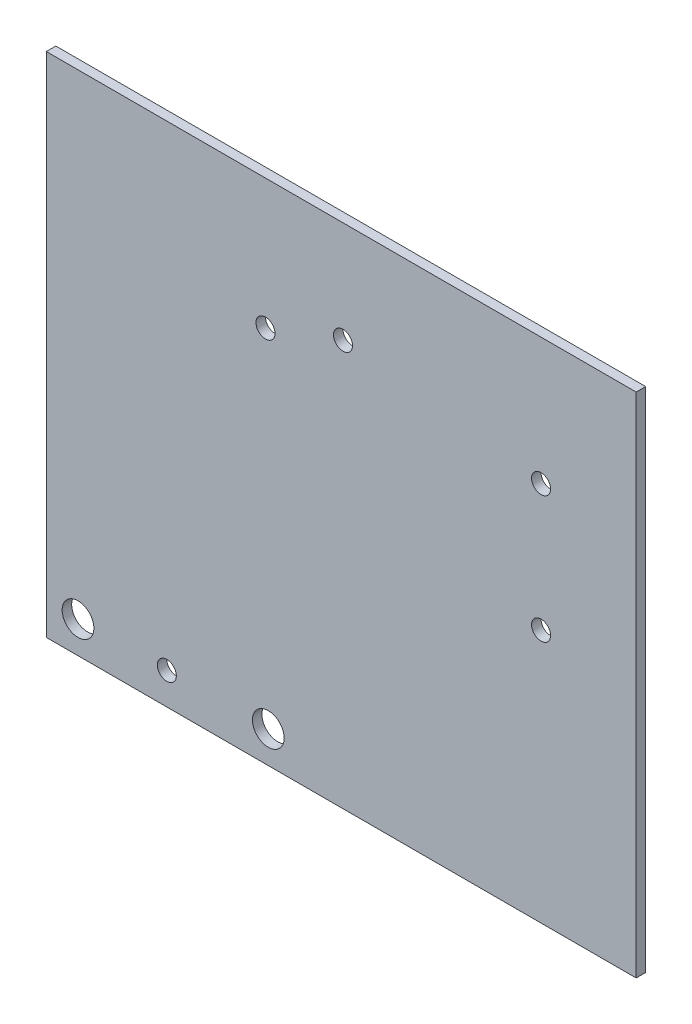
ISO-10303-21;
HEADER;
FILE_DESCRIPTION(('STEP AP214'),'2;1');
FILE_NAME('part.step','',(''),(''),'','','');
FILE_SCHEMA(('AUTOMOTIVE_DESIGN { 1 0 10303 214 1 1 1 1 }'));
ENDSEC;
DATA;
#1=APPLICATION_CONTEXT('core data for automotive mechanical design processes');
#2=APPLICATION_PROTOCOL_DEFINITION('international standard','automotive_design',2000,#1);
#3=PRODUCT_CONTEXT('',#1,'mechanical');
#4=PRODUCT('Part','Part','',(#3));
#5=PRODUCT_RELATED_PRODUCT_CATEGORY('part','',(#4));
#6=PRODUCT_DEFINITION_FORMATION('','',#4);
#7=PRODUCT_DEFINITION_CONTEXT('part definition',#1,'design');
#8=PRODUCT_DEFINITION('design','',#6,#7);
#9=PRODUCT_DEFINITION_SHAPE('','',#8);
#10=(LENGTH_UNIT() NAMED_UNIT(*) SI_UNIT(.MILLI.,.METRE.));
#11=(NAMED_UNIT(*) PLANE_ANGLE_UNIT() SI_UNIT($,.RADIAN.));
#12=(NAMED_UNIT(*) SI_UNIT($,.STERADIAN.) SOLID_ANGLE_UNIT());
#13=UNCERTAINTY_MEASURE_WITH_UNIT(LENGTH_MEASURE(1.E-05),#10,'distance_accuracy_value','');
#14=(GEOMETRIC_REPRESENTATION_CONTEXT(3) GLOBAL_UNCERTAINTY_ASSIGNED_CONTEXT((#13)) GLOBAL_UNIT_ASSIGNED_CONTEXT((#10,
#11,#12)) REPRESENTATION_CONTEXT('',''));
#15=CARTESIAN_POINT('',(0.,0.,0.));
#16=DIRECTION('',(0.,0.,1.));
#17=DIRECTION('',(1.,0.,0.));
#18=AXIS2_PLACEMENT_3D('',#15,#16,#17);
#19=CARTESIAN_POINT('',(0.,0.,1.5));
#20=DIRECTION('',(1.,0.,0.));
#21=DIRECTION('',(0.,1.,0.));
#22=AXIS2_PLACEMENT_3D('',#19,#20,#21);
#23=PLANE('',#22);
#24=DIRECTION('',(0.,-1.,0.));
#25=VECTOR('',#24,1.);
#26=CARTESIAN_POINT('',(0.,0.,0.));
#27=LINE('',#26,#25);
#28=CARTESIAN_POINT('',(0.,80.,0.));
#29=VERTEX_POINT('',#28);
#30=CARTESIAN_POINT('',(0.,0.,0.));
#31=VERTEX_POINT('',#30);
#32=EDGE_CURVE('E96',#29,#31,#27,.T.);
#33=ORIENTED_EDGE('',*,*,#32,.T.);
#34=DIRECTION('',(0.,0.,-1.));
#35=VECTOR('',#34,1.);
#36=CARTESIAN_POINT('',(0.,0.,1.5));
#37=LINE('',#36,#35);
#38=CARTESIAN_POINT('',(0.,0.,1.5));
#39=VERTEX_POINT('',#38);
#40=EDGE_CURVE('E11',#39,#31,#37,.T.);
#41=ORIENTED_EDGE('',*,*,#40,.F.);
#42=DIRECTION('',(0.,-1.,0.));
#43=VECTOR('',#42,1.);
#44=CARTESIAN_POINT('',(0.,0.,1.5));
#45=LINE('',#44,#43);
#46=CARTESIAN_POINT('',(0.,80.,1.5));
#47=VERTEX_POINT('',#46);
#48=EDGE_CURVE('E84',#47,#39,#45,.T.);
#49=ORIENTED_EDGE('',*,*,#48,.F.);
#50=DIRECTION('',(0.,0.,-1.));
#51=VECTOR('',#50,1.);
#52=CARTESIAN_POINT('',(0.,80.,1.5));
#53=LINE('',#52,#51);
#54=EDGE_CURVE('E92',#47,#29,#53,.T.);
#55=ORIENTED_EDGE('',*,*,#54,.T.);
#56=EDGE_LOOP('',(#33,#41,#49,#55));
#57=FACE_BOUND('',#56,.T.);
#58=ADVANCED_FACE('F33',(#57),#23,.F.);
#59=CARTESIAN_POINT('',(0.,0.,1.5));
#60=DIRECTION('',(0.,1.,0.));
#61=DIRECTION('',(0.,0.,1.));
#62=AXIS2_PLACEMENT_3D('',#59,#60,#61);
#63=PLANE('',#62);
#64=DIRECTION('',(1.,0.,0.));
#65=VECTOR('',#64,1.);
#66=CARTESIAN_POINT('',(0.,0.,0.));
#67=LINE('',#66,#65);
#68=CARTESIAN_POINT('',(93.,0.,0.));
#69=VERTEX_POINT('',#68);
#70=EDGE_CURVE('E88',#31,#69,#67,.T.);
#71=ORIENTED_EDGE('',*,*,#70,.T.);
#72=DIRECTION('',(0.,0.,-1.));
#73=VECTOR('',#72,1.);
#74=CARTESIAN_POINT('',(93.,0.,1.5));
#75=LINE('',#74,#73);
#76=CARTESIAN_POINT('',(93.,0.,1.5));
#77=VERTEX_POINT('',#76);
#78=EDGE_CURVE('E41',#77,#69,#75,.T.);
#79=ORIENTED_EDGE('',*,*,#78,.F.);
#80=DIRECTION('',(1.,0.,0.));
#81=VECTOR('',#80,1.);
#82=CARTESIAN_POINT('',(0.,0.,1.5));
#83=LINE('',#82,#81);
#84=EDGE_CURVE('E79',#39,#77,#83,.T.);
#85=ORIENTED_EDGE('',*,*,#84,.F.);
#86=ORIENTED_EDGE('',*,*,#40,.T.);
#87=EDGE_LOOP('',(#71,#79,#85,#86));
#88=FACE_BOUND('',#87,.T.);
#89=ADVANCED_FACE('F87',(#88),#63,.F.);
#90=CARTESIAN_POINT('',(93.,0.,1.5));
#91=DIRECTION('',(-1.,0.,0.));
#92=DIRECTION('',(0.,-1.,0.));
#93=AXIS2_PLACEMENT_3D('',#90,#91,#92);
#94=PLANE('',#93);
#95=DIRECTION('',(0.,1.,0.));
#96=VECTOR('',#95,1.);
#97=CARTESIAN_POINT('',(93.,0.,0.));
#98=LINE('',#97,#96);
#99=CARTESIAN_POINT('',(93.,80.,0.));
#100=VERTEX_POINT('',#99);
#101=EDGE_CURVE('E66',#69,#100,#98,.T.);
#102=ORIENTED_EDGE('',*,*,#101,.T.);
#103=DIRECTION('',(0.,0.,-1.));
#104=VECTOR('',#103,1.);
#105=CARTESIAN_POINT('',(93.,80.,1.5));
#106=LINE('',#105,#104);
#107=CARTESIAN_POINT('',(93.,80.,1.5));
#108=VERTEX_POINT('',#107);
#109=EDGE_CURVE('E89',#108,#100,#106,.T.);
#110=ORIENTED_EDGE('',*,*,#109,.F.);
#111=DIRECTION('',(0.,1.,0.));
#112=VECTOR('',#111,1.);
#113=CARTESIAN_POINT('',(93.,0.,1.5));
#114=LINE('',#113,#112);
#115=EDGE_CURVE('E82',#77,#108,#114,.T.);
#116=ORIENTED_EDGE('',*,*,#115,.F.);
#117=ORIENTED_EDGE('',*,*,#78,.T.);
#118=EDGE_LOOP('',(#102,#110,#116,#117));
#119=FACE_BOUND('',#118,.T.);
#120=ADVANCED_FACE('F90',(#119),#94,.F.);
#121=CARTESIAN_POINT('',(0.,80.,1.5));
#122=DIRECTION('',(0.,-1.,0.));
#123=DIRECTION('',(0.,0.,-1.));
#124=AXIS2_PLACEMENT_3D('',#121,#122,#123);
#125=PLANE('',#124);
#126=DIRECTION('',(-1.,0.,0.));
#127=VECTOR('',#126,1.);
#128=CARTESIAN_POINT('',(0.,80.,0.));
#129=LINE('',#128,#127);
#130=EDGE_CURVE('E72',#100,#29,#129,.T.);
#131=ORIENTED_EDGE('',*,*,#130,.T.);
#132=ORIENTED_EDGE('',*,*,#54,.F.);
#133=DIRECTION('',(-1.,0.,0.));
#134=VECTOR('',#133,1.);
#135=CARTESIAN_POINT('',(0.,80.,1.5));
#136=LINE('',#135,#134);
#137=EDGE_CURVE('E49',#108,#47,#136,.T.);
#138=ORIENTED_EDGE('',*,*,#137,.F.);
#139=ORIENTED_EDGE('',*,*,#109,.T.);
#140=EDGE_LOOP('',(#131,#132,#138,#139));
#141=FACE_BOUND('',#140,.T.);
#142=ADVANCED_FACE('F104',(#141),#125,.F.);
#143=CARTESIAN_POINT('',(0.,0.,1.5));
#144=DIRECTION('',(0.,0.,-1.));
#145=DIRECTION('',(-1.,0.,0.));
#146=AXIS2_PLACEMENT_3D('',#143,#144,#145);
#147=PLANE('',#146);
#148=CARTESIAN_POINT('',(19.,4.99999999999999,1.5));
#149=DIRECTION('',(0.,0.,-1.));
#150=DIRECTION('',(-1.,0.,0.));
#151=AXIS2_PLACEMENT_3D('',#148,#149,#150);
#152=CIRCLE('',#151,1.49999999999999);
#153=CARTESIAN_POINT('',(17.5,4.99999999999999,1.5));
#154=VERTEX_POINT('',#153);
#155=EDGE_CURVE('E145',#154,#154,#152,.T.);
#156=ORIENTED_EDGE('',*,*,#155,.T.);
#157=EDGE_LOOP('',(#156));
#158=FACE_BOUND('',#157,.T.);
#159=CARTESIAN_POINT('',(78.,60.,1.5));
#160=DIRECTION('',(0.,0.,-1.));
#161=DIRECTION('',(-1.,0.,0.));
#162=AXIS2_PLACEMENT_3D('',#159,#160,#161);
#163=CIRCLE('',#162,1.49999999999999);
#164=CARTESIAN_POINT('',(76.5,60.,1.5));
#165=VERTEX_POINT('',#164);
#166=EDGE_CURVE('E139',#165,#165,#163,.T.);
#167=ORIENTED_EDGE('',*,*,#166,.T.);
#168=EDGE_LOOP('',(#167));
#169=FACE_BOUND('',#168,.T.);
#170=CARTESIAN_POINT('',(78.,40.,1.5));
#171=DIRECTION('',(0.,0.,-1.));
#172=DIRECTION('',(-1.,0.,0.));
#173=AXIS2_PLACEMENT_3D('',#170,#171,#172);
#174=CIRCLE('',#173,1.49999999999999);
#175=CARTESIAN_POINT('',(76.5,40.,1.5));
#176=VERTEX_POINT('',#175);
#177=EDGE_CURVE('E133',#176,#176,#174,.T.);
#178=ORIENTED_EDGE('',*,*,#177,.T.);
#179=EDGE_LOOP('',(#178));
#180=FACE_BOUND('',#179,.T.);
#181=CARTESIAN_POINT('',(46.7743085383264,63.9650871619037,1.50000000000002));
#182=DIRECTION('',(0.,0.,-1.));
#183=DIRECTION('',(0.,1.,0.));
#184=AXIS2_PLACEMENT_3D('',#181,#182,#183);
#185=CIRCLE('',#184,1.49999999999999);
#186=CARTESIAN_POINT('',(46.7743085383264,65.4650871619037,1.50000000000002));
#187=VERTEX_POINT('',#186);
#188=EDGE_CURVE('E130',#187,#187,#185,.T.);
#189=ORIENTED_EDGE('',*,*,#188,.T.);
#190=EDGE_LOOP('',(#189));
#191=FACE_BOUND('',#190,.T.);
#192=CARTESIAN_POINT('',(34.5583044681095,59.5188252986701,1.50000000000002));
#193=DIRECTION('',(0.,0.,-1.));
#194=DIRECTION('',(0.,1.,0.));
#195=AXIS2_PLACEMENT_3D('',#192,#193,#194);
#196=CIRCLE('',#195,1.49999999999999);
#197=CARTESIAN_POINT('',(34.5583044681095,61.0188252986701,1.50000000000002));
#198=VERTEX_POINT('',#197);
#199=EDGE_CURVE('E124',#198,#198,#196,.T.);
#200=ORIENTED_EDGE('',*,*,#199,.T.);
#201=EDGE_LOOP('',(#200));
#202=FACE_BOUND('',#201,.T.);
#203=CARTESIAN_POINT('',(35.,5.,1.5));
#204=DIRECTION('',(0.,0.,-1.));
#205=DIRECTION('',(-1.,0.,0.));
#206=AXIS2_PLACEMENT_3D('',#203,#204,#205);
#207=CIRCLE('',#206,2.5);
#208=CARTESIAN_POINT('',(32.5,5.,1.5));
#209=VERTEX_POINT('',#208);
#210=EDGE_CURVE('E115',#209,#209,#207,.T.);
#211=ORIENTED_EDGE('',*,*,#210,.T.);
#212=EDGE_LOOP('',(#211));
#213=FACE_BOUND('',#212,.T.);
#214=CARTESIAN_POINT('',(4.99999999999997,5.,1.5));
#215=DIRECTION('',(0.,0.,-1.));
#216=DIRECTION('',(-1.,0.,0.));
#217=AXIS2_PLACEMENT_3D('',#214,#215,#216);
#218=CIRCLE('',#217,2.5);
#219=CARTESIAN_POINT('',(2.49999999999997,5.,1.5));
#220=VERTEX_POINT('',#219);
#221=EDGE_CURVE('E99',#220,#220,#218,.T.);
#222=ORIENTED_EDGE('',*,*,#221,.T.);
#223=EDGE_LOOP('',(#222));
#224=FACE_BOUND('',#223,.T.);
#225=ORIENTED_EDGE('',*,*,#48,.T.);
#226=ORIENTED_EDGE('',*,*,#84,.T.);
#227=ORIENTED_EDGE('',*,*,#115,.T.);
#228=ORIENTED_EDGE('',*,*,#137,.T.);
#229=EDGE_LOOP('',(#225,#226,#227,#228));
#230=FACE_BOUND('',#229,.T.);
#231=ADVANCED_FACE('F80',(#158,#169,#180,#191,#202,#213,#224,#230),#147,.F.);
#232=CARTESIAN_POINT('',(0.,0.,0.));
#233=DIRECTION('',(0.,0.,-1.));
#234=DIRECTION('',(-1.,0.,0.));
#235=AXIS2_PLACEMENT_3D('',#232,#233,#234);
#236=PLANE('',#235);
#237=CARTESIAN_POINT('',(19.,4.99999999999999,0.));
#238=DIRECTION('',(0.,0.,1.));
#239=DIRECTION('',(1.,0.,0.));
#240=AXIS2_PLACEMENT_3D('',#237,#238,#239);
#241=CIRCLE('',#240,1.5);
#242=CARTESIAN_POINT('',(20.5,4.99999999999999,0.));
#243=VERTEX_POINT('',#242);
#244=EDGE_CURVE('E148',#243,#243,#241,.T.);
#245=ORIENTED_EDGE('',*,*,#244,.T.);
#246=EDGE_LOOP('',(#245));
#247=FACE_BOUND('',#246,.T.);
#248=CARTESIAN_POINT('',(78.,60.,0.));
#249=DIRECTION('',(0.,0.,-1.));
#250=DIRECTION('',(-1.,0.,0.));
#251=AXIS2_PLACEMENT_3D('',#248,#249,#250);
#252=CIRCLE('',#251,1.49999999999999);
#253=CARTESIAN_POINT('',(76.5,60.,0.));
#254=VERTEX_POINT('',#253);
#255=EDGE_CURVE('E142',#254,#254,#252,.T.);
#256=ORIENTED_EDGE('',*,*,#255,.F.);
#257=EDGE_LOOP('',(#256));
#258=FACE_BOUND('',#257,.T.);
#259=CARTESIAN_POINT('',(78.,40.,0.));
#260=DIRECTION('',(0.,0.,-1.));
#261=DIRECTION('',(-1.,0.,0.));
#262=AXIS2_PLACEMENT_3D('',#259,#260,#261);
#263=CIRCLE('',#262,1.49999999999999);
#264=CARTESIAN_POINT('',(76.5,40.,0.));
#265=VERTEX_POINT('',#264);
#266=EDGE_CURVE('E136',#265,#265,#263,.T.);
#267=ORIENTED_EDGE('',*,*,#266,.F.);
#268=EDGE_LOOP('',(#267));
#269=FACE_BOUND('',#268,.T.);
#270=CARTESIAN_POINT('',(46.7743085383264,63.9650871619037,0.));
#271=DIRECTION('',(0.,0.,-1.));
#272=DIRECTION('',(-1.,0.,0.));
#273=AXIS2_PLACEMENT_3D('',#270,#271,#272);
#274=CIRCLE('',#273,1.49999999999999);
#275=CARTESIAN_POINT('',(45.2743085383264,63.9650871619037,0.));
#276=VERTEX_POINT('',#275);
#277=EDGE_CURVE('E127',#276,#276,#274,.T.);
#278=ORIENTED_EDGE('',*,*,#277,.F.);
#279=EDGE_LOOP('',(#278));
#280=FACE_BOUND('',#279,.T.);
#281=CARTESIAN_POINT('',(34.5583044681095,59.5188252986701,0.));
#282=DIRECTION('',(0.,0.,-1.));
#283=DIRECTION('',(-1.,0.,0.));
#284=AXIS2_PLACEMENT_3D('',#281,#282,#283);
#285=CIRCLE('',#284,1.49999999999999);
#286=CARTESIAN_POINT('',(33.0583044681096,59.5188252986701,0.));
#287=VERTEX_POINT('',#286);
#288=EDGE_CURVE('E121',#287,#287,#285,.T.);
#289=ORIENTED_EDGE('',*,*,#288,.F.);
#290=EDGE_LOOP('',(#289));
#291=FACE_BOUND('',#290,.T.);
#292=CARTESIAN_POINT('',(35.,5.,0.));
#293=DIRECTION('',(0.,0.,-1.));
#294=DIRECTION('',(-1.,0.,0.));
#295=AXIS2_PLACEMENT_3D('',#292,#293,#294);
#296=CIRCLE('',#295,2.5);
#297=CARTESIAN_POINT('',(32.5,5.,0.));
#298=VERTEX_POINT('',#297);
#299=EDGE_CURVE('E118',#298,#298,#296,.T.);
#300=ORIENTED_EDGE('',*,*,#299,.F.);
#301=EDGE_LOOP('',(#300));
#302=FACE_BOUND('',#301,.T.);
#303=CARTESIAN_POINT('',(4.99999999999997,5.,0.));
#304=DIRECTION('',(0.,0.,-1.));
#305=DIRECTION('',(-1.,0.,0.));
#306=AXIS2_PLACEMENT_3D('',#303,#304,#305);
#307=CIRCLE('',#306,2.5);
#308=CARTESIAN_POINT('',(2.49999999999997,5.,0.));
#309=VERTEX_POINT('',#308);
#310=EDGE_CURVE('E112',#309,#309,#307,.T.);
#311=ORIENTED_EDGE('',*,*,#310,.F.);
#312=EDGE_LOOP('',(#311));
#313=FACE_BOUND('',#312,.T.);
#314=ORIENTED_EDGE('',*,*,#32,.F.);
#315=ORIENTED_EDGE('',*,*,#130,.F.);
#316=ORIENTED_EDGE('',*,*,#101,.F.);
#317=ORIENTED_EDGE('',*,*,#70,.F.);
#318=EDGE_LOOP('',(#314,#315,#316,#317));
#319=FACE_BOUND('',#318,.T.);
#320=ADVANCED_FACE('F107',(#247,#258,#269,#280,#291,#302,#313,#319),#236,.T.);
#321=CARTESIAN_POINT('',(4.99999999999997,5.,0.));
#322=DIRECTION('',(0.,0.,-1.));
#323=DIRECTION('',(-1.,0.,0.));
#324=AXIS2_PLACEMENT_3D('',#321,#322,#323);
#325=CYLINDRICAL_SURFACE('',#324,2.5);
#326=ORIENTED_EDGE('',*,*,#310,.T.);
#327=EDGE_LOOP('',(#326));
#328=FACE_BOUND('',#327,.T.);
#329=ORIENTED_EDGE('',*,*,#221,.F.);
#330=EDGE_LOOP('',(#329));
#331=FACE_BOUND('',#330,.T.);
#332=ADVANCED_FACE('F176',(#328,#331),#325,.F.);
#333=CARTESIAN_POINT('',(35.,5.,0.));
#334=DIRECTION('',(0.,0.,-1.));
#335=DIRECTION('',(-1.,0.,0.));
#336=AXIS2_PLACEMENT_3D('',#333,#334,#335);
#337=CYLINDRICAL_SURFACE('',#336,2.5);
#338=ORIENTED_EDGE('',*,*,#299,.T.);
#339=EDGE_LOOP('',(#338));
#340=FACE_BOUND('',#339,.T.);
#341=ORIENTED_EDGE('',*,*,#210,.F.);
#342=EDGE_LOOP('',(#341));
#343=FACE_BOUND('',#342,.T.);
#344=ADVANCED_FACE('F178',(#340,#343),#337,.F.);
#345=CARTESIAN_POINT('',(34.5583044681095,59.5188252986701,-1.5));
#346=DIRECTION('',(0.,0.,-1.));
#347=DIRECTION('',(0.,1.,0.));
#348=AXIS2_PLACEMENT_3D('',#345,#346,#347);
#349=CYLINDRICAL_SURFACE('',#348,1.49999999999999);
#350=ORIENTED_EDGE('',*,*,#288,.T.);
#351=EDGE_LOOP('',(#350));
#352=FACE_BOUND('',#351,.T.);
#353=ORIENTED_EDGE('',*,*,#199,.F.);
#354=EDGE_LOOP('',(#353));
#355=FACE_BOUND('',#354,.T.);
#356=ADVANCED_FACE('F185',(#352,#355),#349,.F.);
#357=CARTESIAN_POINT('',(46.7743085383264,63.9650871619037,-1.49999999999999));
#358=DIRECTION('',(0.,0.,-1.));
#359=DIRECTION('',(0.,1.,0.));
#360=AXIS2_PLACEMENT_3D('',#357,#358,#359);
#361=CYLINDRICAL_SURFACE('',#360,1.49999999999999);
#362=ORIENTED_EDGE('',*,*,#277,.T.);
#363=EDGE_LOOP('',(#362));
#364=FACE_BOUND('',#363,.T.);
#365=ORIENTED_EDGE('',*,*,#188,.F.);
#366=EDGE_LOOP('',(#365));
#367=FACE_BOUND('',#366,.T.);
#368=ADVANCED_FACE('F236',(#364,#367),#361,.F.);
#369=CARTESIAN_POINT('',(78.,40.,0.));
#370=DIRECTION('',(0.,0.,-1.));
#371=DIRECTION('',(-1.,0.,0.));
#372=AXIS2_PLACEMENT_3D('',#369,#370,#371);
#373=CYLINDRICAL_SURFACE('',#372,1.49999999999999);
#374=ORIENTED_EDGE('',*,*,#266,.T.);
#375=EDGE_LOOP('',(#374));
#376=FACE_BOUND('',#375,.T.);
#377=ORIENTED_EDGE('',*,*,#177,.F.);
#378=EDGE_LOOP('',(#377));
#379=FACE_BOUND('',#378,.T.);
#380=ADVANCED_FACE('F229',(#376,#379),#373,.F.);
#381=CARTESIAN_POINT('',(78.,60.,0.));
#382=DIRECTION('',(0.,0.,-1.));
#383=DIRECTION('',(-1.,0.,0.));
#384=AXIS2_PLACEMENT_3D('',#381,#382,#383);
#385=CYLINDRICAL_SURFACE('',#384,1.49999999999999);
#386=ORIENTED_EDGE('',*,*,#255,.T.);
#387=EDGE_LOOP('',(#386));
#388=FACE_BOUND('',#387,.T.);
#389=ORIENTED_EDGE('',*,*,#166,.F.);
#390=EDGE_LOOP('',(#389));
#391=FACE_BOUND('',#390,.T.);
#392=ADVANCED_FACE('F157',(#388,#391),#385,.F.);
#393=CARTESIAN_POINT('',(19.,4.99999999999999,3.));
#394=DIRECTION('',(0.,0.,1.));
#395=DIRECTION('',(1.,0.,0.));
#396=AXIS2_PLACEMENT_3D('',#393,#394,#395);
#397=CYLINDRICAL_SURFACE('',#396,1.49999999999999);
#398=ORIENTED_EDGE('',*,*,#244,.F.);
#399=EDGE_LOOP('',(#398));
#400=FACE_BOUND('',#399,.T.);
#401=ORIENTED_EDGE('',*,*,#155,.F.);
#402=EDGE_LOOP('',(#401));
#403=FACE_BOUND('',#402,.T.);
#404=ADVANCED_FACE('F154',(#400,#403),#397,.F.);
#405=CLOSED_SHELL('',(#58,#89,#120,#142,#231,#320,#332,#344,#356,#368,#380,#392,#404));
#406=MANIFOLD_SOLID_BREP('B2',#405);
#407=ADVANCED_BREP_SHAPE_REPRESENTATION('',(#18,#406),#14);
#408=SHAPE_DEFINITION_REPRESENTATION(#9,#407);
ENDSEC;
END-ISO-10303-21;
